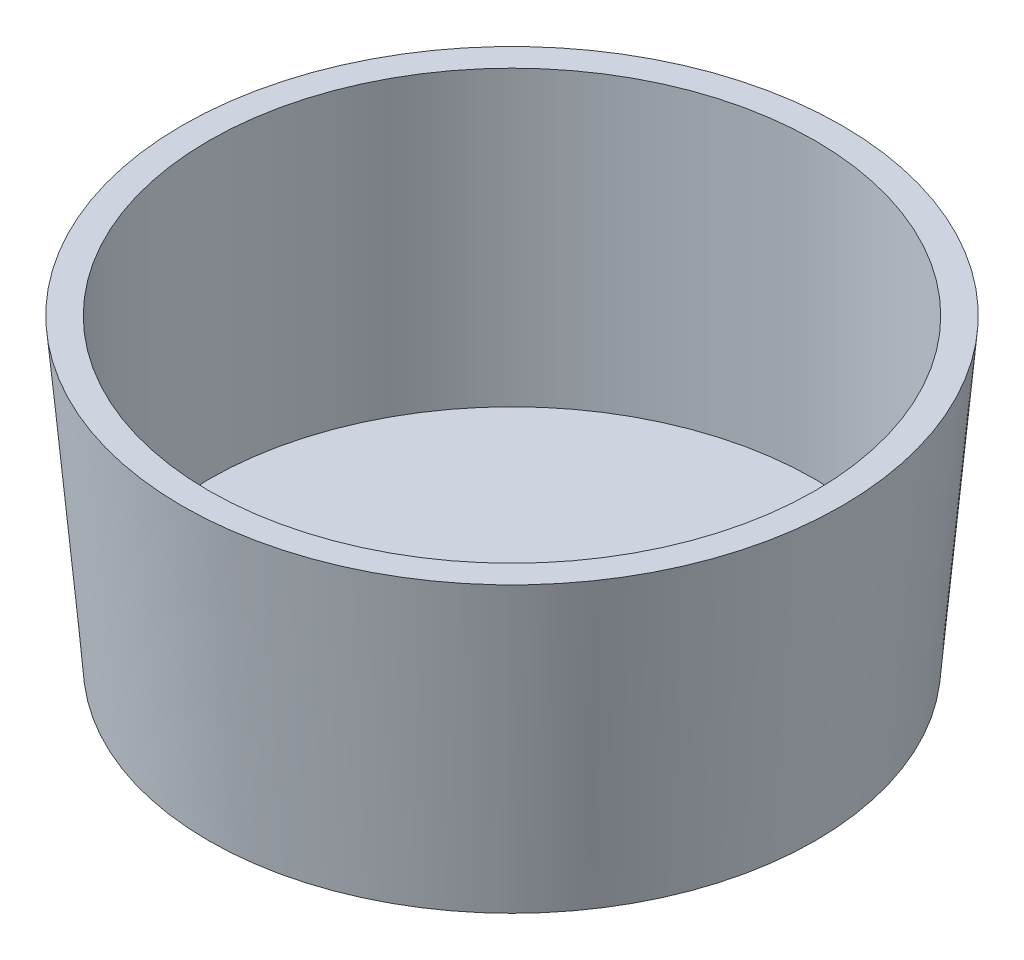
ISO-10303-21;
HEADER;
FILE_DESCRIPTION(('STEP AP214'),'2;1');
FILE_NAME('part.step','',(''),(''),'','','');
FILE_SCHEMA(('AUTOMOTIVE_DESIGN { 1 0 10303 214 1 1 1 1 }'));
ENDSEC;
DATA;
#1=APPLICATION_CONTEXT('core data for automotive mechanical design processes');
#2=APPLICATION_PROTOCOL_DEFINITION('international standard','automotive_design',2000,#1);
#3=PRODUCT_CONTEXT('',#1,'mechanical');
#4=PRODUCT('Part','Part','',(#3));
#5=PRODUCT_RELATED_PRODUCT_CATEGORY('part','',(#4));
#6=PRODUCT_DEFINITION_FORMATION('','',#4);
#7=PRODUCT_DEFINITION_CONTEXT('part definition',#1,'design');
#8=PRODUCT_DEFINITION('design','',#6,#7);
#9=PRODUCT_DEFINITION_SHAPE('','',#8);
#10=(LENGTH_UNIT() NAMED_UNIT(*) SI_UNIT(.MILLI.,.METRE.));
#11=(NAMED_UNIT(*) PLANE_ANGLE_UNIT() SI_UNIT($,.RADIAN.));
#12=(NAMED_UNIT(*) SI_UNIT($,.STERADIAN.) SOLID_ANGLE_UNIT());
#13=UNCERTAINTY_MEASURE_WITH_UNIT(LENGTH_MEASURE(1.E-05),#10,'distance_accuracy_value','');
#14=(GEOMETRIC_REPRESENTATION_CONTEXT(3) GLOBAL_UNCERTAINTY_ASSIGNED_CONTEXT((#13)) GLOBAL_UNIT_ASSIGNED_CONTEXT((#10,
#11,#12)) REPRESENTATION_CONTEXT('',''));
#15=CARTESIAN_POINT('',(0.,0.,0.));
#16=DIRECTION('',(0.,0.,1.));
#17=DIRECTION('',(1.,0.,0.));
#18=AXIS2_PLACEMENT_3D('',#15,#16,#17);
#19=CARTESIAN_POINT('',(0.,0.,0.));
#20=DIRECTION('',(0.,1.,0.));
#21=DIRECTION('',(0.,0.,1.));
#22=AXIS2_PLACEMENT_3D('',#19,#20,#21);
#23=CONICAL_SURFACE('',#22,152.4,0.0872664625997167);
#24=CARTESIAN_POINT('',(0.,152.4,0.));
#25=DIRECTION('',(0.,1.,0.));
#26=DIRECTION('',(0.,0.,1.));
#27=AXIS2_PLACEMENT_3D('',#24,#25,#26);
#28=CIRCLE('',#27,165.733272321351);
#29=CARTESIAN_POINT('',(0.,152.4,165.733272321351));
#30=VERTEX_POINT('',#29);
#31=EDGE_CURVE('E10',#30,#30,#28,.T.);
#32=ORIENTED_EDGE('',*,*,#31,.F.);
#33=EDGE_LOOP('',(#32));
#34=FACE_BOUND('',#33,.T.);
#35=CARTESIAN_POINT('',(0.,0.,0.));
#36=DIRECTION('',(0.,1.,0.));
#37=DIRECTION('',(0.,0.,1.));
#38=AXIS2_PLACEMENT_3D('',#35,#36,#37);
#39=CIRCLE('',#38,152.4);
#40=CARTESIAN_POINT('',(0.,0.,152.4));
#41=VERTEX_POINT('',#40);
#42=EDGE_CURVE('E50',#41,#41,#39,.T.);
#43=ORIENTED_EDGE('',*,*,#42,.T.);
#44=EDGE_LOOP('',(#43));
#45=FACE_BOUND('',#44,.T.);
#46=ADVANCED_FACE('F41',(#34,#45),#23,.T.);
#47=CARTESIAN_POINT('',(0.,152.4,0.));
#48=DIRECTION('',(0.,1.,0.));
#49=DIRECTION('',(0.,0.,1.));
#50=AXIS2_PLACEMENT_3D('',#47,#48,#49);
#51=PLANE('',#50);
#52=CARTESIAN_POINT('',(0.,152.4,0.));
#53=DIRECTION('',(0.,1.,0.));
#54=DIRECTION('',(0.,0.,1.));
#55=AXIS2_PLACEMENT_3D('',#52,#53,#54);
#56=CIRCLE('',#55,152.4);
#57=CARTESIAN_POINT('',(0.,152.4,152.4));
#58=VERTEX_POINT('',#57);
#59=EDGE_CURVE('E51',#58,#58,#56,.T.);
#60=ORIENTED_EDGE('',*,*,#59,.F.);
#61=EDGE_LOOP('',(#60));
#62=FACE_BOUND('',#61,.T.);
#63=ORIENTED_EDGE('',*,*,#31,.T.);
#64=EDGE_LOOP('',(#63));
#65=FACE_BOUND('',#64,.T.);
#66=ADVANCED_FACE('F74',(#62,#65),#51,.T.);
#67=CARTESIAN_POINT('',(0.,0.,0.));
#68=DIRECTION('',(0.,1.,0.));
#69=DIRECTION('',(0.,0.,1.));
#70=AXIS2_PLACEMENT_3D('',#67,#68,#69);
#71=PLANE('',#70);
#72=ORIENTED_EDGE('',*,*,#42,.F.);
#73=EDGE_LOOP('',(#72));
#74=FACE_BOUND('',#73,.T.);
#75=ADVANCED_FACE('F63',(#74),#71,.F.);
#76=CARTESIAN_POINT('',(0.,152.4,0.));
#77=DIRECTION('',(0.,-1.,0.));
#78=DIRECTION('',(0.,0.,-1.));
#79=AXIS2_PLACEMENT_3D('',#76,#77,#78);
#80=CYLINDRICAL_SURFACE('',#79,152.4);
#81=ORIENTED_EDGE('',*,*,#59,.T.);
#82=EDGE_LOOP('',(#81));
#83=FACE_BOUND('',#82,.T.);
#84=CARTESIAN_POINT('',(0.,5.,0.));
#85=DIRECTION('',(0.,1.,0.));
#86=DIRECTION('',(0.,0.,1.));
#87=AXIS2_PLACEMENT_3D('',#84,#85,#86);
#88=CIRCLE('',#87,152.4);
#89=CARTESIAN_POINT('',(0.,5.,152.4));
#90=VERTEX_POINT('',#89);
#91=EDGE_CURVE('E54',#90,#90,#88,.T.);
#92=ORIENTED_EDGE('',*,*,#91,.F.);
#93=EDGE_LOOP('',(#92));
#94=FACE_BOUND('',#93,.T.);
#95=ADVANCED_FACE('F64',(#83,#94),#80,.F.);
#96=CARTESIAN_POINT('',(0.,5.,0.));
#97=DIRECTION('',(0.,1.,0.));
#98=DIRECTION('',(0.,0.,1.));
#99=AXIS2_PLACEMENT_3D('',#96,#97,#98);
#100=PLANE('',#99);
#101=ORIENTED_EDGE('',*,*,#91,.T.);
#102=EDGE_LOOP('',(#101));
#103=FACE_BOUND('',#102,.T.);
#104=ADVANCED_FACE('F62',(#103),#100,.T.);
#105=CLOSED_SHELL('',(#46,#66,#75,#95,#104));
#106=MANIFOLD_SOLID_BREP('B2',#105);
#107=ADVANCED_BREP_SHAPE_REPRESENTATION('',(#18,#106),#14);
#108=SHAPE_DEFINITION_REPRESENTATION(#9,#107);
ENDSEC;
END-ISO-10303-21;
